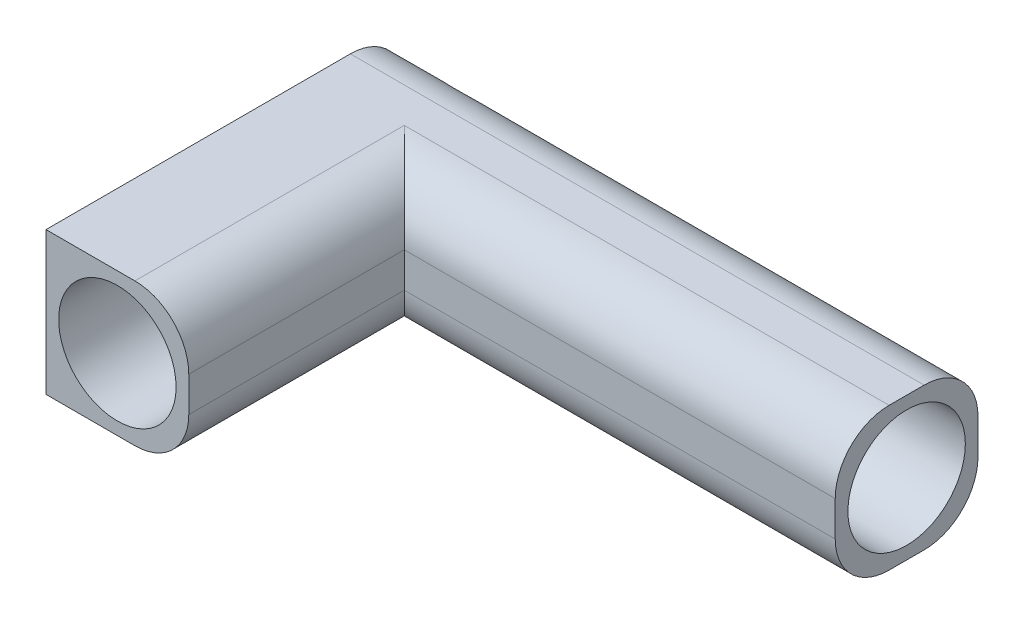
ISO-10303-21;
HEADER;
FILE_DESCRIPTION(('STEP AP214'),'2;1');
FILE_NAME('part.step','',(''),(''),'','','');
FILE_SCHEMA(('AUTOMOTIVE_DESIGN { 1 0 10303 214 1 1 1 1 }'));
ENDSEC;
DATA;
#1=APPLICATION_CONTEXT('core data for automotive mechanical design processes');
#2=APPLICATION_PROTOCOL_DEFINITION('international standard','automotive_design',2000,#1);
#3=PRODUCT_CONTEXT('',#1,'mechanical');
#4=PRODUCT('Part','Part','',(#3));
#5=PRODUCT_RELATED_PRODUCT_CATEGORY('part','',(#4));
#6=PRODUCT_DEFINITION_FORMATION('','',#4);
#7=PRODUCT_DEFINITION_CONTEXT('part definition',#1,'design');
#8=PRODUCT_DEFINITION('design','',#6,#7);
#9=PRODUCT_DEFINITION_SHAPE('','',#8);
#10=(LENGTH_UNIT() NAMED_UNIT(*) SI_UNIT(.MILLI.,.METRE.));
#11=(NAMED_UNIT(*) PLANE_ANGLE_UNIT() SI_UNIT($,.RADIAN.));
#12=(NAMED_UNIT(*) SI_UNIT($,.STERADIAN.) SOLID_ANGLE_UNIT());
#13=UNCERTAINTY_MEASURE_WITH_UNIT(LENGTH_MEASURE(1.E-05),#10,'distance_accuracy_value','');
#14=(GEOMETRIC_REPRESENTATION_CONTEXT(3) GLOBAL_UNCERTAINTY_ASSIGNED_CONTEXT((#13)) GLOBAL_UNIT_ASSIGNED_CONTEXT((#10,
#11,#12)) REPRESENTATION_CONTEXT('',''));
#15=CARTESIAN_POINT('',(0.,0.,0.));
#16=DIRECTION('',(0.,0.,1.));
#17=DIRECTION('',(1.,0.,0.));
#18=AXIS2_PLACEMENT_3D('',#15,#16,#17);
#19=CARTESIAN_POINT('',(0.,26.5,-66.5));
#20=DIRECTION('',(0.,0.,1.));
#21=DIRECTION('',(1.,0.,0.));
#22=AXIS2_PLACEMENT_3D('',#19,#20,#21);
#23=PLANE('',#22);
#24=DIRECTION('',(0.,-1.,0.));
#25=VECTOR('',#24,1.);
#26=CARTESIAN_POINT('',(0.,26.5,-66.5));
#27=LINE('',#26,#25);
#28=CARTESIAN_POINT('',(0.,16.5,-66.5));
#29=VERTEX_POINT('',#28);
#30=CARTESIAN_POINT('',(0.,10.,-66.5));
#31=VERTEX_POINT('',#30);
#32=EDGE_CURVE('E284',#29,#31,#27,.T.);
#33=ORIENTED_EDGE('',*,*,#32,.F.);
#34=DIRECTION('',(-1.,0.,0.));
#35=VECTOR('',#34,1.);
#36=CARTESIAN_POINT('',(0.,16.5,-66.5));
#37=LINE('',#36,#35);
#38=CARTESIAN_POINT('',(2.8457941196841,16.5,-66.5));
#39=VERTEX_POINT('',#38);
#40=EDGE_CURVE('E196',#29,#39,#37,.F.);
#41=ORIENTED_EDGE('',*,*,#40,.T.);
#42=CARTESIAN_POINT('',(13.25,13.25,-66.5));
#43=DIRECTION('',(0.,0.,1.));
#44=DIRECTION('',(1.,0.,0.));
#45=AXIS2_PLACEMENT_3D('',#42,#43,#44);
#46=CIRCLE('',#45,10.9);
#47=CARTESIAN_POINT('',(2.8457941196841,10.,-66.5));
#48=VERTEX_POINT('',#47);
#49=EDGE_CURVE('E343',#39,#48,#46,.T.);
#50=ORIENTED_EDGE('',*,*,#49,.T.);
#51=DIRECTION('',(-1.,0.,0.));
#52=VECTOR('',#51,1.);
#53=CARTESIAN_POINT('',(0.,10.,-66.5));
#54=LINE('',#53,#52);
#55=EDGE_CURVE('E195',#48,#31,#54,.T.);
#56=ORIENTED_EDGE('',*,*,#55,.T.);
#57=EDGE_LOOP('',(#33,#41,#50,#56));
#58=FACE_BOUND('',#57,.T.);
#59=ADVANCED_FACE('F39',(#58),#23,.F.);
#60=CARTESIAN_POINT('',(13.25,13.25,-66.5));
#61=DIRECTION('',(0.,0.,1.));
#62=DIRECTION('',(1.,0.,0.));
#63=AXIS2_PLACEMENT_3D('',#60,#61,#62);
#64=CYLINDRICAL_SURFACE('',#63,10.9);
#65=CARTESIAN_POINT('',(13.25,13.25,0.));
#66=DIRECTION('',(0.,0.,1.));
#67=DIRECTION('',(1.,0.,0.));
#68=AXIS2_PLACEMENT_3D('',#65,#66,#67);
#69=CIRCLE('',#68,10.9);
#70=CARTESIAN_POINT('',(24.15,13.25,0.));
#71=VERTEX_POINT('',#70);
#72=EDGE_CURVE('E352',#71,#71,#69,.T.);
#73=ORIENTED_EDGE('',*,*,#72,.T.);
#74=EDGE_LOOP('',(#73));
#75=FACE_BOUND('',#74,.T.);
#76=CARTESIAN_POINT('',(13.25,13.25,-53.25));
#77=DIRECTION('',(-0.707106781186547,0.,0.707106781186548));
#78=DIRECTION('',(0.707106781186548,0.,0.707106781186547));
#79=AXIS2_PLACEMENT_3D('',#76,#77,#78);
#80=ELLIPSE('',#79,15.4149278298667,10.9);
#81=CARTESIAN_POINT('',(13.25,24.15,-53.25));
#82=VERTEX_POINT('',#81);
#83=CARTESIAN_POINT('',(13.25,2.35,-53.25));
#84=VERTEX_POINT('',#83);
#85=EDGE_CURVE('E152',#82,#84,#80,.F.);
#86=ORIENTED_EDGE('',*,*,#85,.T.);
#87=CARTESIAN_POINT('',(13.25,13.25,-53.25));
#88=DIRECTION('',(0.707106781186548,0.,0.707106781186547));
#89=DIRECTION('',(-0.707106781186547,0.,0.707106781186548));
#90=AXIS2_PLACEMENT_3D('',#87,#88,#89);
#91=ELLIPSE('',#90,15.4149278298667,10.9);
#92=EDGE_CURVE('E150',#84,#82,#91,.F.);
#93=ORIENTED_EDGE('',*,*,#92,.T.);
#94=EDGE_LOOP('',(#86,#93));
#95=FACE_BOUND('',#94,.T.);
#96=ADVANCED_FACE('F158',(#75,#95),#64,.F.);
#97=CARTESIAN_POINT('',(26.5,26.5,0.));
#98=DIRECTION('',(0.,0.,-1.));
#99=DIRECTION('',(-1.,0.,0.));
#100=AXIS2_PLACEMENT_3D('',#97,#98,#99);
#101=PLANE('',#100);
#102=ORIENTED_EDGE('',*,*,#72,.F.);
#103=EDGE_LOOP('',(#102));
#104=FACE_BOUND('',#103,.T.);
#105=DIRECTION('',(0.,-1.,0.));
#106=VECTOR('',#105,1.);
#107=CARTESIAN_POINT('',(26.5,26.5,0.));
#108=LINE('',#107,#106);
#109=CARTESIAN_POINT('',(26.5,16.5,0.));
#110=VERTEX_POINT('',#109);
#111=CARTESIAN_POINT('',(26.5,10.,0.));
#112=VERTEX_POINT('',#111);
#113=EDGE_CURVE('E157',#110,#112,#108,.T.);
#114=ORIENTED_EDGE('',*,*,#113,.F.);
#115=CARTESIAN_POINT('',(16.5,16.5,0.));
#116=DIRECTION('',(0.,0.,-1.));
#117=DIRECTION('',(-1.,0.,0.));
#118=AXIS2_PLACEMENT_3D('',#115,#116,#117);
#119=CIRCLE('',#118,10.);
#120=CARTESIAN_POINT('',(16.5,26.5,0.));
#121=VERTEX_POINT('',#120);
#122=EDGE_CURVE('E179',#110,#121,#119,.F.);
#123=ORIENTED_EDGE('',*,*,#122,.T.);
#124=DIRECTION('',(1.,0.,0.));
#125=VECTOR('',#124,1.);
#126=CARTESIAN_POINT('',(26.5,26.5,0.));
#127=LINE('',#126,#125);
#128=CARTESIAN_POINT('',(0.,26.5,0.));
#129=VERTEX_POINT('',#128);
#130=EDGE_CURVE('E339',#129,#121,#127,.T.);
#131=ORIENTED_EDGE('',*,*,#130,.F.);
#132=DIRECTION('',(0.,-1.,0.));
#133=VECTOR('',#132,1.);
#134=CARTESIAN_POINT('',(0.,26.5,0.));
#135=LINE('',#134,#133);
#136=CARTESIAN_POINT('',(0.,0.,0.));
#137=VERTEX_POINT('',#136);
#138=EDGE_CURVE('E293',#129,#137,#135,.T.);
#139=ORIENTED_EDGE('',*,*,#138,.T.);
#140=DIRECTION('',(1.,0.,0.));
#141=VECTOR('',#140,1.);
#142=CARTESIAN_POINT('',(26.5,0.,0.));
#143=LINE('',#142,#141);
#144=CARTESIAN_POINT('',(16.5,0.,0.));
#145=VERTEX_POINT('',#144);
#146=EDGE_CURVE('E345',#137,#145,#143,.T.);
#147=ORIENTED_EDGE('',*,*,#146,.T.);
#148=CARTESIAN_POINT('',(16.5,10.,0.));
#149=DIRECTION('',(0.,0.,-1.));
#150=DIRECTION('',(-1.,0.,0.));
#151=AXIS2_PLACEMENT_3D('',#148,#149,#150);
#152=CIRCLE('',#151,10.);
#153=EDGE_CURVE('E178',#145,#112,#152,.F.);
#154=ORIENTED_EDGE('',*,*,#153,.T.);
#155=EDGE_LOOP('',(#114,#123,#131,#139,#147,#154));
#156=FACE_BOUND('',#155,.T.);
#157=ADVANCED_FACE('F244',(#104,#156),#101,.F.);
#158=CARTESIAN_POINT('',(26.5,26.5,-40.));
#159=DIRECTION('',(-1.,0.,0.));
#160=DIRECTION('',(0.,0.,1.));
#161=AXIS2_PLACEMENT_3D('',#158,#159,#160);
#162=PLANE('',#161);
#163=DIRECTION('',(0.,-1.,0.));
#164=VECTOR('',#163,1.);
#165=CARTESIAN_POINT('',(26.5,26.5,-40.));
#166=LINE('',#165,#164);
#167=CARTESIAN_POINT('',(26.5,16.5,-40.));
#168=VERTEX_POINT('',#167);
#169=CARTESIAN_POINT('',(26.5,10.,-40.));
#170=VERTEX_POINT('',#169);
#171=EDGE_CURVE('E321',#168,#170,#166,.T.);
#172=ORIENTED_EDGE('',*,*,#171,.F.);
#173=DIRECTION('',(0.,0.,-1.));
#174=VECTOR('',#173,1.);
#175=CARTESIAN_POINT('',(26.5,16.5,-40.));
#176=LINE('',#175,#174);
#177=EDGE_CURVE('E176',#168,#110,#176,.F.);
#178=ORIENTED_EDGE('',*,*,#177,.T.);
#179=ORIENTED_EDGE('',*,*,#113,.T.);
#180=DIRECTION('',(0.,0.,-1.));
#181=VECTOR('',#180,1.);
#182=CARTESIAN_POINT('',(26.5,10.,-40.));
#183=LINE('',#182,#181);
#184=EDGE_CURVE('E173',#112,#170,#183,.T.);
#185=ORIENTED_EDGE('',*,*,#184,.T.);
#186=EDGE_LOOP('',(#172,#178,#179,#185));
#187=FACE_BOUND('',#186,.T.);
#188=ADVANCED_FACE('F245',(#187),#162,.F.);
#189=CARTESIAN_POINT('',(106.5,26.5,-40.));
#190=DIRECTION('',(0.,0.,-1.));
#191=DIRECTION('',(-1.,0.,0.));
#192=AXIS2_PLACEMENT_3D('',#189,#190,#191);
#193=PLANE('',#192);
#194=DIRECTION('',(0.,-1.,0.));
#195=VECTOR('',#194,1.);
#196=CARTESIAN_POINT('',(106.5,26.5,-40.));
#197=LINE('',#196,#195);
#198=CARTESIAN_POINT('',(106.5,16.5,-40.));
#199=VERTEX_POINT('',#198);
#200=CARTESIAN_POINT('',(106.5,10.,-40.));
#201=VERTEX_POINT('',#200);
#202=EDGE_CURVE('E330',#199,#201,#197,.T.);
#203=ORIENTED_EDGE('',*,*,#202,.F.);
#204=DIRECTION('',(1.,0.,0.));
#205=VECTOR('',#204,1.);
#206=CARTESIAN_POINT('',(106.5,16.5,-40.));
#207=LINE('',#206,#205);
#208=EDGE_CURVE('E11',#199,#168,#207,.F.);
#209=ORIENTED_EDGE('',*,*,#208,.T.);
#210=ORIENTED_EDGE('',*,*,#171,.T.);
#211=DIRECTION('',(1.,0.,0.));
#212=VECTOR('',#211,1.);
#213=CARTESIAN_POINT('',(106.5,10.,-40.));
#214=LINE('',#213,#212);
#215=EDGE_CURVE('E47',#170,#201,#214,.T.);
#216=ORIENTED_EDGE('',*,*,#215,.T.);
#217=EDGE_LOOP('',(#203,#209,#210,#216));
#218=FACE_BOUND('',#217,.T.);
#219=ADVANCED_FACE('F238',(#218),#193,.F.);
#220=CARTESIAN_POINT('',(106.5,26.5,-66.5));
#221=DIRECTION('',(-1.,0.,0.));
#222=DIRECTION('',(0.,0.,1.));
#223=AXIS2_PLACEMENT_3D('',#220,#221,#222);
#224=PLANE('',#223);
#225=CARTESIAN_POINT('',(106.5,13.25,-53.25));
#226=DIRECTION('',(1.,0.,0.));
#227=DIRECTION('',(0.,0.,-1.));
#228=AXIS2_PLACEMENT_3D('',#225,#226,#227);
#229=CIRCLE('',#228,10.9);
#230=CARTESIAN_POINT('',(106.5,13.25,-64.15));
#231=VERTEX_POINT('',#230);
#232=EDGE_CURVE('E307',#231,#231,#229,.T.);
#233=ORIENTED_EDGE('',*,*,#232,.F.);
#234=EDGE_LOOP('',(#233));
#235=FACE_BOUND('',#234,.T.);
#236=DIRECTION('',(0.,-1.,0.));
#237=VECTOR('',#236,1.);
#238=CARTESIAN_POINT('',(106.5,26.5,-66.5));
#239=LINE('',#238,#237);
#240=CARTESIAN_POINT('',(106.5,16.5,-66.5));
#241=VERTEX_POINT('',#240);
#242=CARTESIAN_POINT('',(106.5,10.,-66.5));
#243=VERTEX_POINT('',#242);
#244=EDGE_CURVE('E290',#241,#243,#239,.T.);
#245=ORIENTED_EDGE('',*,*,#244,.F.);
#246=CARTESIAN_POINT('',(106.5,16.5,-56.5));
#247=DIRECTION('',(-1.,0.,0.));
#248=DIRECTION('',(0.,0.,1.));
#249=AXIS2_PLACEMENT_3D('',#246,#247,#248);
#250=CIRCLE('',#249,10.);
#251=CARTESIAN_POINT('',(106.5,26.5,-56.5));
#252=VERTEX_POINT('',#251);
#253=EDGE_CURVE('E306',#241,#252,#250,.F.);
#254=ORIENTED_EDGE('',*,*,#253,.T.);
#255=DIRECTION('',(0.,0.,-1.));
#256=VECTOR('',#255,1.);
#257=CARTESIAN_POINT('',(106.5,26.5,-66.5));
#258=LINE('',#257,#256);
#259=CARTESIAN_POINT('',(106.5,26.5,-50.));
#260=VERTEX_POINT('',#259);
#261=EDGE_CURVE('E350',#260,#252,#258,.T.);
#262=ORIENTED_EDGE('',*,*,#261,.F.);
#263=CARTESIAN_POINT('',(106.5,16.5,-50.));
#264=DIRECTION('',(-1.,0.,0.));
#265=DIRECTION('',(0.,0.,1.));
#266=AXIS2_PLACEMENT_3D('',#263,#264,#265);
#267=CIRCLE('',#266,10.);
#268=EDGE_CURVE('E64',#260,#199,#267,.F.);
#269=ORIENTED_EDGE('',*,*,#268,.T.);
#270=ORIENTED_EDGE('',*,*,#202,.T.);
#271=CARTESIAN_POINT('',(106.5,10.,-50.));
#272=DIRECTION('',(-1.,0.,0.));
#273=DIRECTION('',(0.,0.,1.));
#274=AXIS2_PLACEMENT_3D('',#271,#272,#273);
#275=CIRCLE('',#274,10.);
#276=CARTESIAN_POINT('',(106.5,0.,-50.));
#277=VERTEX_POINT('',#276);
#278=EDGE_CURVE('E296',#201,#277,#275,.F.);
#279=ORIENTED_EDGE('',*,*,#278,.T.);
#280=DIRECTION('',(0.,0.,-1.));
#281=VECTOR('',#280,1.);
#282=CARTESIAN_POINT('',(106.5,0.,-66.5));
#283=LINE('',#282,#281);
#284=CARTESIAN_POINT('',(106.5,0.,-56.5));
#285=VERTEX_POINT('',#284);
#286=EDGE_CURVE('E338',#277,#285,#283,.T.);
#287=ORIENTED_EDGE('',*,*,#286,.T.);
#288=CARTESIAN_POINT('',(106.5,10.,-56.5));
#289=DIRECTION('',(-1.,0.,0.));
#290=DIRECTION('',(0.,0.,1.));
#291=AXIS2_PLACEMENT_3D('',#288,#289,#290);
#292=CIRCLE('',#291,10.);
#293=EDGE_CURVE('E305',#285,#243,#292,.F.);
#294=ORIENTED_EDGE('',*,*,#293,.T.);
#295=EDGE_LOOP('',(#245,#254,#262,#269,#270,#279,#287,#294));
#296=FACE_BOUND('',#295,.T.);
#297=ADVANCED_FACE('F234',(#235,#296),#224,.F.);
#298=CARTESIAN_POINT('',(23.6542058803159,10.,-66.5));
#299=VERTEX_POINT('',#298);
#300=CARTESIAN_POINT('',(23.6542058803159,16.5,-66.5));
#301=VERTEX_POINT('',#300);
#302=EDGE_CURVE('E355',#299,#301,#46,.T.);
#303=ORIENTED_EDGE('',*,*,#302,.T.);
#304=DIRECTION('',(-1.,0.,0.));
#305=VECTOR('',#304,1.);
#306=CARTESIAN_POINT('',(0.,16.5,-66.5));
#307=LINE('',#306,#305);
#308=EDGE_CURVE('E200',#301,#241,#307,.F.);
#309=ORIENTED_EDGE('',*,*,#308,.T.);
#310=ORIENTED_EDGE('',*,*,#244,.T.);
#311=DIRECTION('',(-1.,0.,0.));
#312=VECTOR('',#311,1.);
#313=CARTESIAN_POINT('',(0.,10.,-66.5));
#314=LINE('',#313,#312);
#315=EDGE_CURVE('E191',#243,#299,#314,.T.);
#316=ORIENTED_EDGE('',*,*,#315,.T.);
#317=EDGE_LOOP('',(#303,#309,#310,#316));
#318=FACE_BOUND('',#317,.T.);
#319=ADVANCED_FACE('F229',(#318),#23,.F.);
#320=CARTESIAN_POINT('',(0.,26.5,0.));
#321=DIRECTION('',(1.,0.,0.));
#322=DIRECTION('',(0.,0.,-1.));
#323=AXIS2_PLACEMENT_3D('',#320,#321,#322);
#324=PLANE('',#323);
#325=CARTESIAN_POINT('',(0.,13.25,-53.25));
#326=DIRECTION('',(1.,0.,0.));
#327=DIRECTION('',(0.,0.,-1.));
#328=AXIS2_PLACEMENT_3D('',#325,#326,#327);
#329=CIRCLE('',#328,10.9);
#330=CARTESIAN_POINT('',(0.,13.25,-64.15));
#331=VERTEX_POINT('',#330);
#332=EDGE_CURVE('E314',#331,#331,#329,.T.);
#333=ORIENTED_EDGE('',*,*,#332,.T.);
#334=EDGE_LOOP('',(#333));
#335=FACE_BOUND('',#334,.T.);
#336=DIRECTION('',(0.,0.,1.));
#337=VECTOR('',#336,1.);
#338=CARTESIAN_POINT('',(0.,26.5,0.));
#339=LINE('',#338,#337);
#340=CARTESIAN_POINT('',(0.,26.5,-56.5));
#341=VERTEX_POINT('',#340);
#342=EDGE_CURVE('E337',#341,#129,#339,.T.);
#343=ORIENTED_EDGE('',*,*,#342,.F.);
#344=CARTESIAN_POINT('',(0.,16.5,-56.5));
#345=DIRECTION('',(1.,0.,0.));
#346=DIRECTION('',(0.,0.,-1.));
#347=AXIS2_PLACEMENT_3D('',#344,#345,#346);
#348=CIRCLE('',#347,10.);
#349=EDGE_CURVE('E188',#341,#29,#348,.F.);
#350=ORIENTED_EDGE('',*,*,#349,.T.);
#351=ORIENTED_EDGE('',*,*,#32,.T.);
#352=CARTESIAN_POINT('',(0.,10.,-56.5));
#353=DIRECTION('',(1.,0.,0.));
#354=DIRECTION('',(0.,0.,-1.));
#355=AXIS2_PLACEMENT_3D('',#352,#353,#354);
#356=CIRCLE('',#355,10.);
#357=CARTESIAN_POINT('',(0.,0.,-56.5));
#358=VERTEX_POINT('',#357);
#359=EDGE_CURVE('E189',#31,#358,#356,.F.);
#360=ORIENTED_EDGE('',*,*,#359,.T.);
#361=DIRECTION('',(0.,0.,1.));
#362=VECTOR('',#361,1.);
#363=CARTESIAN_POINT('',(0.,0.,0.));
#364=LINE('',#363,#362);
#365=EDGE_CURVE('E340',#358,#137,#364,.T.);
#366=ORIENTED_EDGE('',*,*,#365,.T.);
#367=ORIENTED_EDGE('',*,*,#138,.F.);
#368=EDGE_LOOP('',(#343,#350,#351,#360,#366,#367));
#369=FACE_BOUND('',#368,.T.);
#370=ADVANCED_FACE('F224',(#335,#369),#324,.F.);
#371=CARTESIAN_POINT('',(0.,26.5,0.));
#372=DIRECTION('',(0.,-1.,0.));
#373=DIRECTION('',(0.,0.,-1.));
#374=AXIS2_PLACEMENT_3D('',#371,#372,#373);
#375=PLANE('',#374);
#376=ORIENTED_EDGE('',*,*,#261,.T.);
#377=DIRECTION('',(-1.,0.,0.));
#378=VECTOR('',#377,1.);
#379=CARTESIAN_POINT('',(0.,26.5,-56.5));
#380=LINE('',#379,#378);
#381=EDGE_CURVE('E167',#252,#341,#380,.T.);
#382=ORIENTED_EDGE('',*,*,#381,.T.);
#383=ORIENTED_EDGE('',*,*,#342,.T.);
#384=ORIENTED_EDGE('',*,*,#130,.T.);
#385=DIRECTION('',(0.,0.,-1.));
#386=VECTOR('',#385,1.);
#387=CARTESIAN_POINT('',(16.5,26.5,0.));
#388=LINE('',#387,#386);
#389=CARTESIAN_POINT('',(16.5,26.5,-50.));
#390=VERTEX_POINT('',#389);
#391=EDGE_CURVE('E170',#121,#390,#388,.T.);
#392=ORIENTED_EDGE('',*,*,#391,.T.);
#393=DIRECTION('',(1.,0.,0.));
#394=VECTOR('',#393,1.);
#395=CARTESIAN_POINT('',(0.,26.5,-50.));
#396=LINE('',#395,#394);
#397=EDGE_CURVE('E160',#390,#260,#396,.T.);
#398=ORIENTED_EDGE('',*,*,#397,.T.);
#399=EDGE_LOOP('',(#376,#382,#383,#384,#392,#398));
#400=FACE_BOUND('',#399,.T.);
#401=ADVANCED_FACE('F216',(#400),#375,.F.);
#402=CARTESIAN_POINT('',(0.,0.,0.));
#403=DIRECTION('',(0.,-1.,0.));
#404=DIRECTION('',(0.,0.,-1.));
#405=AXIS2_PLACEMENT_3D('',#402,#403,#404);
#406=PLANE('',#405);
#407=ORIENTED_EDGE('',*,*,#365,.F.);
#408=DIRECTION('',(-1.,0.,0.));
#409=VECTOR('',#408,1.);
#410=CARTESIAN_POINT('',(106.5,0.,-56.5));
#411=LINE('',#410,#409);
#412=EDGE_CURVE('E187',#358,#285,#411,.F.);
#413=ORIENTED_EDGE('',*,*,#412,.T.);
#414=ORIENTED_EDGE('',*,*,#286,.F.);
#415=DIRECTION('',(1.,0.,0.));
#416=VECTOR('',#415,1.);
#417=CARTESIAN_POINT('',(26.5,0.,-50.));
#418=LINE('',#417,#416);
#419=CARTESIAN_POINT('',(16.5,0.,-50.));
#420=VERTEX_POINT('',#419);
#421=EDGE_CURVE('E185',#277,#420,#418,.F.);
#422=ORIENTED_EDGE('',*,*,#421,.T.);
#423=DIRECTION('',(0.,0.,-1.));
#424=VECTOR('',#423,1.);
#425=CARTESIAN_POINT('',(16.5,0.,0.));
#426=LINE('',#425,#424);
#427=EDGE_CURVE('E183',#420,#145,#426,.F.);
#428=ORIENTED_EDGE('',*,*,#427,.T.);
#429=ORIENTED_EDGE('',*,*,#146,.F.);
#430=EDGE_LOOP('',(#407,#413,#414,#422,#428,#429));
#431=FACE_BOUND('',#430,.T.);
#432=ADVANCED_FACE('F219',(#431),#406,.T.);
#433=CARTESIAN_POINT('',(13.25,13.25,-53.25));
#434=DIRECTION('',(-0.707106781186547,0.,0.707106781186548));
#435=DIRECTION('',(0.707106781186548,0.,0.707106781186547));
#436=AXIS2_PLACEMENT_3D('',#433,#434,#435);
#437=ELLIPSE('',#436,15.4149278298667,10.9);
#438=EDGE_CURVE('E141',#82,#84,#437,.T.);
#439=ORIENTED_EDGE('',*,*,#438,.T.);
#440=CARTESIAN_POINT('',(13.25,13.25,-53.25));
#441=DIRECTION('',(0.707106781186548,0.,0.707106781186547));
#442=DIRECTION('',(-0.707106781186547,0.,0.707106781186548));
#443=AXIS2_PLACEMENT_3D('',#440,#441,#442);
#444=ELLIPSE('',#443,15.4149278298667,10.9);
#445=EDGE_CURVE('E148',#84,#82,#444,.T.);
#446=ORIENTED_EDGE('',*,*,#445,.T.);
#447=EDGE_LOOP('',(#439,#446));
#448=FACE_BOUND('',#447,.T.);
#449=ORIENTED_EDGE('',*,*,#49,.F.);
#450=CARTESIAN_POINT('',(2.8457941196841,16.5,-66.5));
#451=CARTESIAN_POINT('',(2.88464672592702,16.6243861980135,-66.5000018375319));
#452=CARTESIAN_POINT('',(2.92572709811874,16.7480493403431,-66.4976787328515));
#453=CARTESIAN_POINT('',(3.01222916332854,16.993660215835,-66.4885632084519));
#454=CARTESIAN_POINT('',(3.05765017352658,17.1156082153532,-66.4817714906982));
#455=CARTESIAN_POINT('',(3.200118274816,17.4781421129981,-66.4549919974717));
#456=CARTESIAN_POINT('',(3.30349699397758,17.7158223848886,-66.4285986984506));
#457=CARTESIAN_POINT('',(3.52484795963407,18.1791758892328,-66.3607668546852));
#458=CARTESIAN_POINT('',(3.64267398274478,18.4049409452479,-66.3194719824814));
#459=CARTESIAN_POINT('',(3.89248232874132,18.8456266620614,-66.2236259048918));
#460=CARTESIAN_POINT('',(4.02446922456363,19.0605437866186,-66.1690704100441));
#461=CARTESIAN_POINT('',(4.30058286463675,19.4773659285029,-66.0489304604639));
#462=CARTESIAN_POINT('',(4.44463848843064,19.679336291958,-65.9834086221667));
#463=CARTESIAN_POINT('',(4.744355018924,20.070911034265,-65.8430132638185));
#464=CARTESIAN_POINT('',(4.90001501929407,20.2605163766906,-65.7681404737913));
#465=CARTESIAN_POINT('',(5.38388466942829,20.8113085016247,-65.531738563742));
#466=CARTESIAN_POINT('',(5.72838774348211,21.1535800974453,-65.3586970408249));
#467=CARTESIAN_POINT('',(6.30393931994564,21.6548787505474,-65.0716382764976));
#468=CARTESIAN_POINT('',(6.52300907320189,21.8311618655614,-64.9627957876634));
#469=CARTESIAN_POINT('',(6.97332608430999,22.1658293228224,-64.7424783730553));
#470=CARTESIAN_POINT('',(7.20457533714213,22.3242107193495,-64.6310030176823));
#471=CARTESIAN_POINT('',(7.67879167476865,22.6228442770978,-64.408569199843));
#472=CARTESIAN_POINT('',(7.921761472171,22.7630922135932,-64.2976108636152));
#473=CARTESIAN_POINT('',(8.41919724733462,23.0250875935412,-64.0797249670166));
#474=CARTESIAN_POINT('',(8.67366100904052,23.1468385836509,-63.9727966368852));
#475=CARTESIAN_POINT('',(9.14587471418709,23.3504685629058,-63.7860476625262));
#476=CARTESIAN_POINT('',(9.36170635649495,23.4355568242152,-63.7048720080955));
#477=CARTESIAN_POINT('',(9.80090306979361,23.5925385470033,-63.5503915904373));
#478=CARTESIAN_POINT('',(10.0242680493896,23.664432168492,-63.4770867317659));
#479=CARTESIAN_POINT('',(10.4777250282644,23.7941916712698,-63.3413139231623));
#480=CARTESIAN_POINT('',(10.7078012559922,23.8520878717172,-63.2788226355229));
#481=CARTESIAN_POINT('',(11.1744064602184,23.9532165017965,-63.1674765729432));
#482=CARTESIAN_POINT('',(11.4109338072887,23.9964525978999,-63.118618388925));
#483=CARTESIAN_POINT('',(11.8486622052475,24.0614102205505,-63.044240387643));
#484=CARTESIAN_POINT('',(12.0490732546009,24.0855335673666,-63.0161711089286));
#485=CARTESIAN_POINT('',(12.4522916342809,24.1226551571158,-62.9727085862606));
#486=CARTESIAN_POINT('',(12.6550986575942,24.1356548100637,-62.9573137357338));
#487=CARTESIAN_POINT('',(13.0615647563208,24.1502668784086,-62.9399959887514));
#488=CARTESIAN_POINT('',(13.2652231496363,24.1518871209526,-62.9380638322026));
#489=CARTESIAN_POINT('',(13.6719896367206,24.1437281486369,-62.9477482717478));
#490=CARTESIAN_POINT('',(13.8750977079185,24.1339484731085,-62.9593654153669));
#491=CARTESIAN_POINT('',(14.2785068502842,24.10324528777,-62.9954763959438));
#492=CARTESIAN_POINT('',(14.4788157390124,24.082365018374,-63.0199202638945));
#493=CARTESIAN_POINT('',(14.8762667727059,24.0298654055655,-63.0804801743603));
#494=CARTESIAN_POINT('',(15.0734075057524,23.9982414058973,-63.1166012773763));
#495=CARTESIAN_POINT('',(15.6591744890684,23.8878444858726,-63.2403272164784));
#496=CARTESIAN_POINT('',(16.0417717477987,23.7935763709773,-63.3432563684598));
#497=CARTESIAN_POINT('',(16.7084080999205,23.591387989085,-63.551850448044));
#498=CARTESIAN_POINT('',(16.9963103371359,23.4904588422306,-63.6524302156835));
#499=CARTESIAN_POINT('',(17.5593750794149,23.26653827981,-63.8646297563021));
#500=CARTESIAN_POINT('',(17.8345306170234,23.1435349732412,-63.9762554649452));
#501=CARTESIAN_POINT('',(18.3725077275348,22.8760297628935,-64.2056724221931));
#502=CARTESIAN_POINT('',(18.6352931414189,22.7314694280386,-64.3234798458809));
#503=CARTESIAN_POINT('',(19.1475628503551,22.4216043315495,-64.560562404601));
#504=CARTESIAN_POINT('',(19.397049286503,22.2563029236261,-64.6798372995459));
#505=CARTESIAN_POINT('',(19.8907535658075,21.899070358283,-64.9200934612386));
#506=CARTESIAN_POINT('',(20.1344893692392,21.7064149823394,-65.0409906659449));
#507=CARTESIAN_POINT('',(20.6064364452311,21.2992213865969,-65.2762620277438));
#508=CARTESIAN_POINT('',(20.8346461759613,21.0846809987601,-65.3906355368134));
#509=CARTESIAN_POINT('',(21.2729703473606,20.6351189096964,-65.6083947476499));
#510=CARTESIAN_POINT('',(21.4831727359769,20.4002095460314,-65.7118345078329));
#511=CARTESIAN_POINT('',(21.884912764795,19.9094860178896,-65.9045118249119));
#512=CARTESIAN_POINT('',(22.0764544423562,19.6536763974311,-65.9937524565339));
#513=CARTESIAN_POINT('',(22.4048926039035,19.1716930181385,-66.1391441281059));
#514=CARTESIAN_POINT('',(22.5453272809355,18.9488539676513,-66.198362467987));
#515=CARTESIAN_POINT('',(22.8108706859483,18.4911550937411,-66.3025687808535));
#516=CARTESIAN_POINT('',(22.9359872740858,18.256301523782,-66.3475640710087));
#517=CARTESIAN_POINT('',(23.1709155621477,17.7730934878217,-66.4216739654849));
#518=CARTESIAN_POINT('',(23.2805328872315,17.5246140122395,-66.4505982970072));
#519=CARTESIAN_POINT('',(23.4311714877529,17.1451696299842,-66.4799757738569));
#520=CARTESIAN_POINT('',(23.4791271841872,17.0174371803611,-66.4874338518369));
#521=CARTESIAN_POINT('',(23.5702743819592,16.7600689361994,-66.4974475398995));
#522=CARTESIAN_POINT('',(23.613465002702,16.6304327948541,-66.5000022452554));
#523=CARTESIAN_POINT('',(23.6542058803159,16.5,-66.5));
#524=B_SPLINE_CURVE_WITH_KNOTS('',3,(#450,#451,#452,#453,#454,#455,#456,#457,#458,#459,#460,
#461,#462,#463,#464,#465,#466,#467,#468,#469,#470,#471,#472,#473,#474,#475,#476,#477,#478,#479,
#480,#481,#482,#483,#484,#485,#486,#487,#488,#489,#490,#491,#492,#493,#494,#495,#496,#497,#498,
#499,#500,#501,#502,#503,#504,#505,#506,#507,#508,#509,#510,#511,#512,#513,#514,#515,#516,#517,
#518,#519,#520,#521,#522,#523),.UNSPECIFIED.,.F.,.F.,(4,2,2,2,2,2,2,2,2,2,2,2,2,2,2,2,2,2,2,2,2,
2,2,2,2,2,2,2,2,2,2,2,2,2,2,2,4),(0.,0.390848926054824,0.78163646907384,1.56194565907483,
2.33492420445955,3.10815312156135,3.87710887922689,4.6460046424128,6.1870839483925,
7.09103210749795,7.99512879498972,8.89943574044322,9.80356907207933,10.5404167209573,
11.2772554335757,12.0124835205342,12.7475275921188,13.3582720305828,13.9689390409563,
14.5791859725426,15.189457564964,15.7973691846621,16.4055446057174,17.6230143822188,
18.5855721736446,19.5486500447985,20.5143874882759,21.4799689783793,22.4790054678226,
23.4781410230633,24.4720795971041,25.4658026466376,26.2747388807275,27.0832582707595,
27.9011565944795,28.3109199620505,28.7207589282482),.UNSPECIFIED.);
#525=EDGE_CURVE('E206',#39,#301,#524,.T.);
#526=ORIENTED_EDGE('',*,*,#525,.T.);
#527=ORIENTED_EDGE('',*,*,#302,.F.);
#528=CARTESIAN_POINT('',(23.6542058803159,10.,-66.5));
#529=CARTESIAN_POINT('',(23.615353274073,9.87561380198645,-66.5000018375319));
#530=CARTESIAN_POINT('',(23.5742729018813,9.75195065965694,-66.4976787328515));
#531=CARTESIAN_POINT('',(23.4877708366715,9.50633978416503,-66.4885632084519));
#532=CARTESIAN_POINT('',(23.4423498264734,9.38439178464682,-66.4817714906982));
#533=CARTESIAN_POINT('',(23.299881725184,9.02185788700186,-66.4549919974717));
#534=CARTESIAN_POINT('',(23.1965030060224,8.78417761511139,-66.4285986984506));
#535=CARTESIAN_POINT('',(22.9751520403659,8.3208241107672,-66.3607668546852));
#536=CARTESIAN_POINT('',(22.8573260172552,8.0950590547521,-66.3194719824814));
#537=CARTESIAN_POINT('',(22.6075176712587,7.65437333793856,-66.2236259048918));
#538=CARTESIAN_POINT('',(22.4755307754364,7.43945621338143,-66.1690704100441));
#539=CARTESIAN_POINT('',(22.1994171353633,7.02263407149709,-66.0489304604639));
#540=CARTESIAN_POINT('',(22.0553615115694,6.82066370804202,-65.9834086221667));
#541=CARTESIAN_POINT('',(21.755644981076,6.42908896573497,-65.8430132638185));
#542=CARTESIAN_POINT('',(21.5999849807059,6.23948362330945,-65.7681404737913));
#543=CARTESIAN_POINT('',(21.1161153305717,5.68869149837528,-65.531738563742));
#544=CARTESIAN_POINT('',(20.7716122565179,5.34641990255469,-65.3586970408249));
#545=CARTESIAN_POINT('',(20.1960606800544,4.84512124945263,-65.0716382764976));
#546=CARTESIAN_POINT('',(19.9769909267981,4.66883813443863,-64.9627957876634));
#547=CARTESIAN_POINT('',(19.52667391569,4.33417067717764,-64.7424783730553));
#548=CARTESIAN_POINT('',(19.2954246628579,4.17578928065046,-64.6310030176823));
#549=CARTESIAN_POINT('',(18.8212083252313,3.87715572290216,-64.408569199843));
#550=CARTESIAN_POINT('',(18.578238527829,3.73690778640681,-64.2976108636152));
#551=CARTESIAN_POINT('',(18.0808027526654,3.47491240645877,-64.0797249670166));
#552=CARTESIAN_POINT('',(17.8263389909595,3.35316141634906,-63.9727966368852));
#553=CARTESIAN_POINT('',(17.3541252858129,3.14953143709417,-63.7860476625262));
#554=CARTESIAN_POINT('',(17.1382936435051,3.06444317578484,-63.7048720080955));
#555=CARTESIAN_POINT('',(16.6990969302064,2.90746145299671,-63.5503915904373));
#556=CARTESIAN_POINT('',(16.4757319506104,2.835567831508,-63.4770867317659));
#557=CARTESIAN_POINT('',(16.0222749717356,2.7058083287302,-63.3413139231623));
#558=CARTESIAN_POINT('',(15.7921987440078,2.64791212828283,-63.2788226355229));
#559=CARTESIAN_POINT('',(15.3255935397816,2.54678349820351,-63.1674765729432));
#560=CARTESIAN_POINT('',(15.0890661927113,2.50354740210011,-63.118618388925));
#561=CARTESIAN_POINT('',(14.6513377947525,2.43858977944946,-63.044240387643));
#562=CARTESIAN_POINT('',(14.4509267453991,2.41446643263336,-63.0161711089286));
#563=CARTESIAN_POINT('',(14.047708365719,2.37734484288424,-62.9727085862606));
#564=CARTESIAN_POINT('',(13.8449013424058,2.36434518993631,-62.9573137357338));
#565=CARTESIAN_POINT('',(13.4384352436792,2.34973312159136,-62.9399959887514));
#566=CARTESIAN_POINT('',(13.2347768503637,2.34811287904744,-62.9380638322026));
#567=CARTESIAN_POINT('',(12.8280103632794,2.35627185136307,-62.9477482717478));
#568=CARTESIAN_POINT('',(12.6249022920815,2.36605152689148,-62.9593654153669));
#569=CARTESIAN_POINT('',(12.2214931497158,2.39675471223002,-62.9954763959438));
#570=CARTESIAN_POINT('',(12.0211842609876,2.41763498162603,-63.0199202638945));
#571=CARTESIAN_POINT('',(11.6237332272941,2.47013459443447,-63.0804801743603));
#572=CARTESIAN_POINT('',(11.4265924942476,2.50175859410271,-63.1166012773763));
#573=CARTESIAN_POINT('',(10.8408255109316,2.61215551412741,-63.2403272164784));
#574=CARTESIAN_POINT('',(10.4582282522013,2.7064236290227,-63.3432563684598));
#575=CARTESIAN_POINT('',(9.79159190007948,2.90861201091502,-63.551850448044));
#576=CARTESIAN_POINT('',(9.50368966286409,3.00954115776937,-63.6524302156835));
#577=CARTESIAN_POINT('',(8.94062492058509,3.23346172018999,-63.8646297563021));
#578=CARTESIAN_POINT('',(8.6654693829766,3.35646502675883,-63.9762554649452));
#579=CARTESIAN_POINT('',(8.12749227246521,3.62397023710648,-64.2056724221931));
#580=CARTESIAN_POINT('',(7.86470685858113,3.76853057196142,-64.3234798458809));
#581=CARTESIAN_POINT('',(7.35243714964485,4.07839566845047,-64.560562404601));
#582=CARTESIAN_POINT('',(7.10295071349696,4.24369707637388,-64.6798372995459));
#583=CARTESIAN_POINT('',(6.60924643419247,4.60092964171698,-64.9200934612386));
#584=CARTESIAN_POINT('',(6.36551063076076,4.79358501766057,-65.0409906659449));
#585=CARTESIAN_POINT('',(5.8935635547689,5.20077861340313,-65.2762620277438));
#586=CARTESIAN_POINT('',(5.6653538240387,5.41531900123986,-65.3906355368134));
#587=CARTESIAN_POINT('',(5.22702965263943,5.86488109030358,-65.6083947476499));
#588=CARTESIAN_POINT('',(5.01682726402313,6.09979045396858,-65.7118345078329));
#589=CARTESIAN_POINT('',(4.61508723520496,6.59051398211042,-65.9045118249119));
#590=CARTESIAN_POINT('',(4.42354555764385,6.84632360256887,-65.9937524565339));
#591=CARTESIAN_POINT('',(4.09510739609646,7.32830698186155,-66.1391441281059));
#592=CARTESIAN_POINT('',(3.95467271906451,7.55114603234875,-66.198362467987));
#593=CARTESIAN_POINT('',(3.68912931405172,8.00884490625886,-66.3025687808535));
#594=CARTESIAN_POINT('',(3.56401272591424,8.24369847621799,-66.3475640710087));
#595=CARTESIAN_POINT('',(3.3290844378523,8.72690651217834,-66.4216739654849));
#596=CARTESIAN_POINT('',(3.21946711276854,8.97538598776048,-66.4505982970072));
#597=CARTESIAN_POINT('',(3.06882851224709,9.35483037001581,-66.4799757738569));
#598=CARTESIAN_POINT('',(3.02087281581275,9.48256281963891,-66.4874338518369));
#599=CARTESIAN_POINT('',(2.92972561804084,9.73993106380055,-66.4974475398995));
#600=CARTESIAN_POINT('',(2.88653499729801,9.86956720514589,-66.5000022452554));
#601=CARTESIAN_POINT('',(2.8457941196841,9.99999999999999,-66.5));
#602=B_SPLINE_CURVE_WITH_KNOTS('',3,(#528,#529,#530,#531,#532,#533,#534,#535,#536,#537,#538,
#539,#540,#541,#542,#543,#544,#545,#546,#547,#548,#549,#550,#551,#552,#553,#554,#555,#556,#557,
#558,#559,#560,#561,#562,#563,#564,#565,#566,#567,#568,#569,#570,#571,#572,#573,#574,#575,#576,
#577,#578,#579,#580,#581,#582,#583,#584,#585,#586,#587,#588,#589,#590,#591,#592,#593,#594,#595,
#596,#597,#598,#599,#600,#601),.UNSPECIFIED.,.F.,.F.,(4,2,2,2,2,2,2,2,2,2,2,2,2,2,2,2,2,2,2,2,2,
2,2,2,2,2,2,2,2,2,2,2,2,2,2,2,4),(0.,0.390848926054822,0.78163646907384,1.56194565907483,
2.33492420445955,3.10815312156134,3.87710887922687,4.64600464241279,6.18708394839249,
7.09103210749795,7.99512879498971,8.89943574044321,9.80356907207932,10.5404167209573,
11.2772554335757,12.0124835205342,12.7475275921188,13.3582720305828,13.9689390409563,
14.5791859725426,15.189457564964,15.7973691846621,16.4055446057174,17.6230143822188,
18.5855721736446,19.5486500447985,20.5143874882759,21.4799689783793,22.4790054678226,
23.4781410230633,24.4720795971041,25.4658026466376,26.2747388807274,27.0832582707595,
27.9011565944795,28.3109199620505,28.7207589282482),.UNSPECIFIED.);
#603=EDGE_CURVE('E201',#299,#48,#602,.T.);
#604=ORIENTED_EDGE('',*,*,#603,.T.);
#605=EDGE_LOOP('',(#449,#526,#527,#604));
#606=FACE_BOUND('',#605,.T.);
#607=ADVANCED_FACE('F162',(#448,#606),#64,.F.);
#608=CARTESIAN_POINT('',(0.,13.25,-53.25));
#609=DIRECTION('',(1.,0.,0.));
#610=DIRECTION('',(0.,0.,-1.));
#611=AXIS2_PLACEMENT_3D('',#608,#609,#610);
#612=CYLINDRICAL_SURFACE('',#611,10.9);
#613=ORIENTED_EDGE('',*,*,#232,.T.);
#614=EDGE_LOOP('',(#613));
#615=FACE_BOUND('',#614,.T.);
#616=ORIENTED_EDGE('',*,*,#85,.F.);
#617=ORIENTED_EDGE('',*,*,#445,.F.);
#618=EDGE_LOOP('',(#616,#617));
#619=FACE_BOUND('',#618,.T.);
#620=ADVANCED_FACE('F153',(#615,#619),#612,.F.);
#621=ORIENTED_EDGE('',*,*,#332,.F.);
#622=EDGE_LOOP('',(#621));
#623=FACE_BOUND('',#622,.T.);
#624=ORIENTED_EDGE('',*,*,#438,.F.);
#625=ORIENTED_EDGE('',*,*,#92,.F.);
#626=EDGE_LOOP('',(#624,#625));
#627=FACE_BOUND('',#626,.T.);
#628=ADVANCED_FACE('F143',(#623,#627),#612,.F.);
#629=CARTESIAN_POINT('',(0.,16.5,-50.));
#630=DIRECTION('',(1.,0.,0.));
#631=DIRECTION('',(0.,0.,-1.));
#632=AXIS2_PLACEMENT_3D('',#629,#630,#631);
#633=CYLINDRICAL_SURFACE('',#632,10.);
#634=ORIENTED_EDGE('',*,*,#268,.F.);
#635=ORIENTED_EDGE('',*,*,#397,.F.);
#636=CARTESIAN_POINT('',(16.5,16.5,-50.));
#637=DIRECTION('',(0.707106781186547,0.,-0.707106781186548));
#638=DIRECTION('',(-0.707106781186548,0.,-0.707106781186547));
#639=AXIS2_PLACEMENT_3D('',#636,#637,#638);
#640=ELLIPSE('',#639,14.1421356237309,10.);
#641=EDGE_CURVE('E308',#168,#390,#640,.F.);
#642=ORIENTED_EDGE('',*,*,#641,.F.);
#643=ORIENTED_EDGE('',*,*,#208,.F.);
#644=EDGE_LOOP('',(#634,#635,#642,#643));
#645=FACE_BOUND('',#644,.T.);
#646=ADVANCED_FACE('F251',(#645),#633,.T.);
#647=CARTESIAN_POINT('',(16.5,16.5,0.));
#648=DIRECTION('',(0.,0.,-1.));
#649=DIRECTION('',(-1.,0.,0.));
#650=AXIS2_PLACEMENT_3D('',#647,#648,#649);
#651=CYLINDRICAL_SURFACE('',#650,10.);
#652=ORIENTED_EDGE('',*,*,#122,.F.);
#653=ORIENTED_EDGE('',*,*,#177,.F.);
#654=ORIENTED_EDGE('',*,*,#641,.T.);
#655=ORIENTED_EDGE('',*,*,#391,.F.);
#656=EDGE_LOOP('',(#652,#653,#654,#655));
#657=FACE_BOUND('',#656,.T.);
#658=ADVANCED_FACE('F249',(#657),#651,.T.);
#659=CARTESIAN_POINT('',(106.5,10.,-50.));
#660=DIRECTION('',(-1.,0.,0.));
#661=DIRECTION('',(0.,0.,1.));
#662=AXIS2_PLACEMENT_3D('',#659,#660,#661);
#663=CYLINDRICAL_SURFACE('',#662,10.);
#664=ORIENTED_EDGE('',*,*,#278,.F.);
#665=ORIENTED_EDGE('',*,*,#215,.F.);
#666=CARTESIAN_POINT('',(16.5,10.,-50.));
#667=DIRECTION('',(-0.707106781186547,0.,0.707106781186548));
#668=DIRECTION('',(0.707106781186548,0.,0.707106781186547));
#669=AXIS2_PLACEMENT_3D('',#666,#667,#668);
#670=ELLIPSE('',#669,14.1421356237309,10.);
#671=EDGE_CURVE('E42',#420,#170,#670,.T.);
#672=ORIENTED_EDGE('',*,*,#671,.F.);
#673=ORIENTED_EDGE('',*,*,#421,.F.);
#674=EDGE_LOOP('',(#664,#665,#672,#673));
#675=FACE_BOUND('',#674,.T.);
#676=ADVANCED_FACE('F254',(#675),#663,.T.);
#677=CARTESIAN_POINT('',(16.5,10.,-40.));
#678=DIRECTION('',(0.,0.,1.));
#679=DIRECTION('',(1.,0.,0.));
#680=AXIS2_PLACEMENT_3D('',#677,#678,#679);
#681=CYLINDRICAL_SURFACE('',#680,10.);
#682=ORIENTED_EDGE('',*,*,#153,.F.);
#683=ORIENTED_EDGE('',*,*,#427,.F.);
#684=ORIENTED_EDGE('',*,*,#671,.T.);
#685=ORIENTED_EDGE('',*,*,#184,.F.);
#686=EDGE_LOOP('',(#682,#683,#684,#685));
#687=FACE_BOUND('',#686,.T.);
#688=ADVANCED_FACE('F256',(#687),#681,.T.);
#689=CARTESIAN_POINT('',(0.,16.5,-56.5));
#690=DIRECTION('',(-1.,0.,0.));
#691=DIRECTION('',(0.,0.,1.));
#692=AXIS2_PLACEMENT_3D('',#689,#690,#691);
#693=CYLINDRICAL_SURFACE('',#692,10.);
#694=ORIENTED_EDGE('',*,*,#525,.F.);
#695=ORIENTED_EDGE('',*,*,#40,.F.);
#696=ORIENTED_EDGE('',*,*,#349,.F.);
#697=ORIENTED_EDGE('',*,*,#381,.F.);
#698=ORIENTED_EDGE('',*,*,#253,.F.);
#699=ORIENTED_EDGE('',*,*,#308,.F.);
#700=EDGE_LOOP('',(#694,#695,#696,#697,#698,#699));
#701=FACE_BOUND('',#700,.T.);
#702=ADVANCED_FACE('F265',(#701),#693,.T.);
#703=CARTESIAN_POINT('',(0.,10.,-56.5));
#704=DIRECTION('',(1.,0.,0.));
#705=DIRECTION('',(0.,0.,-1.));
#706=AXIS2_PLACEMENT_3D('',#703,#704,#705);
#707=CYLINDRICAL_SURFACE('',#706,10.);
#708=ORIENTED_EDGE('',*,*,#293,.F.);
#709=ORIENTED_EDGE('',*,*,#412,.F.);
#710=ORIENTED_EDGE('',*,*,#359,.F.);
#711=ORIENTED_EDGE('',*,*,#55,.F.);
#712=ORIENTED_EDGE('',*,*,#603,.F.);
#713=ORIENTED_EDGE('',*,*,#315,.F.);
#714=EDGE_LOOP('',(#708,#709,#710,#711,#712,#713));
#715=FACE_BOUND('',#714,.T.);
#716=ADVANCED_FACE('F41',(#715),#707,.T.);
#717=CLOSED_SHELL('',(#59,#96,#157,#188,#219,#297,#319,#370,#401,#432,#607,#620,#628,#646,#658,
#676,#688,#702,#716));
#718=MANIFOLD_SOLID_BREP('B2',#717);
#719=ADVANCED_BREP_SHAPE_REPRESENTATION('',(#18,#718),#14);
#720=SHAPE_DEFINITION_REPRESENTATION(#9,#719);
ENDSEC;
END-ISO-10303-21;
